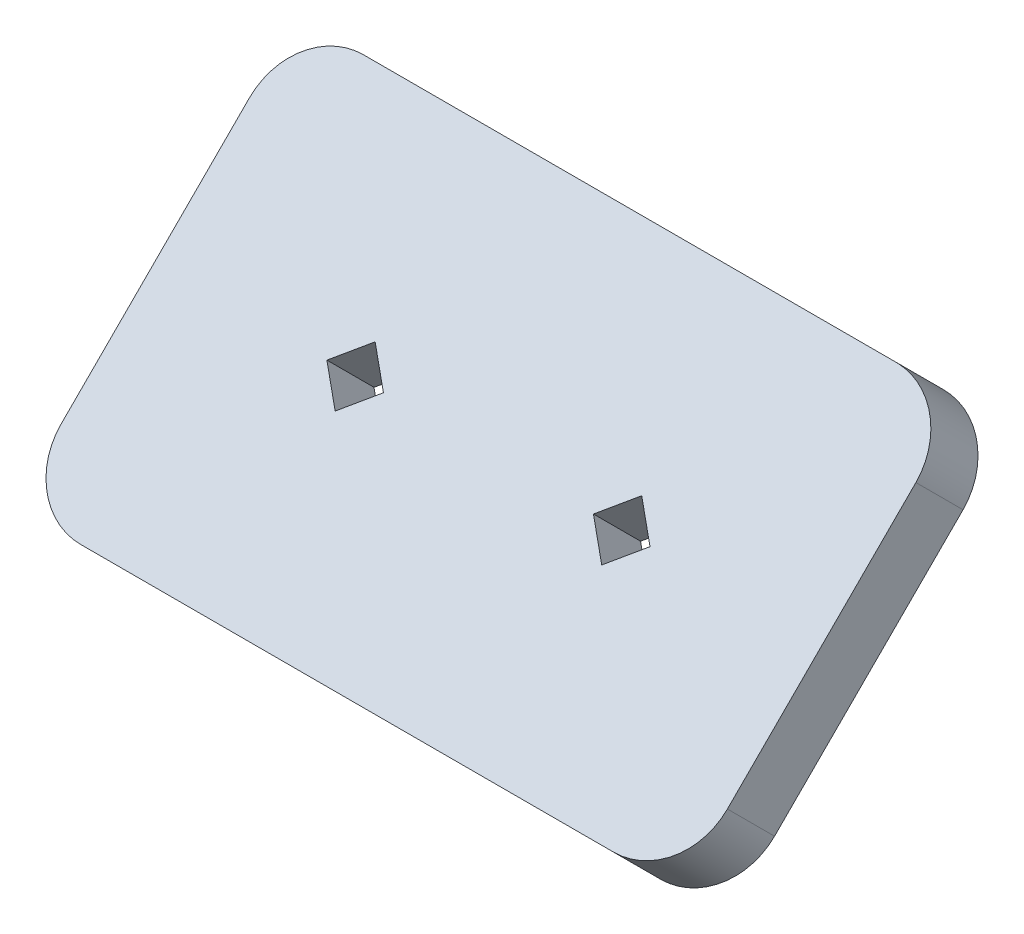
ISO-10303-21;
HEADER;
FILE_DESCRIPTION(('STEP AP214'),'2;1');
FILE_NAME('part.step','',(''),(''),'','','');
FILE_SCHEMA(('AUTOMOTIVE_DESIGN { 1 0 10303 214 1 1 1 1 }'));
ENDSEC;
DATA;
#1=APPLICATION_CONTEXT('core data for automotive mechanical design processes');
#2=APPLICATION_PROTOCOL_DEFINITION('international standard','automotive_design',2000,#1);
#3=PRODUCT_CONTEXT('',#1,'mechanical');
#4=PRODUCT('Part','Part','',(#3));
#5=PRODUCT_RELATED_PRODUCT_CATEGORY('part','',(#4));
#6=PRODUCT_DEFINITION_FORMATION('','',#4);
#7=PRODUCT_DEFINITION_CONTEXT('part definition',#1,'design');
#8=PRODUCT_DEFINITION('design','',#6,#7);
#9=PRODUCT_DEFINITION_SHAPE('','',#8);
#10=(LENGTH_UNIT() NAMED_UNIT(*) SI_UNIT(.MILLI.,.METRE.));
#11=(NAMED_UNIT(*) PLANE_ANGLE_UNIT() SI_UNIT($,.RADIAN.));
#12=(NAMED_UNIT(*) SI_UNIT($,.STERADIAN.) SOLID_ANGLE_UNIT());
#13=UNCERTAINTY_MEASURE_WITH_UNIT(LENGTH_MEASURE(1.E-05),#10,'distance_accuracy_value','');
#14=(GEOMETRIC_REPRESENTATION_CONTEXT(3) GLOBAL_UNCERTAINTY_ASSIGNED_CONTEXT((#13)) GLOBAL_UNIT_ASSIGNED_CONTEXT((#10,
#11,#12)) REPRESENTATION_CONTEXT('',''));
#15=CARTESIAN_POINT('',(0.,0.,0.));
#16=DIRECTION('',(0.,0.,1.));
#17=DIRECTION('',(1.,0.,0.));
#18=AXIS2_PLACEMENT_3D('',#15,#16,#17);
#19=CARTESIAN_POINT('',(17.5,38.138785920236,59.1752126605359));
#20=DIRECTION('',(0.,-0.707106781186547,-0.707106781186548));
#21=DIRECTION('',(0.,0.707106781186548,-0.707106781186547));
#22=AXIS2_PLACEMENT_3D('',#19,#20,#21);
#23=PLANE('',#22);
#24=DIRECTION('',(0.707106781186548,-0.5,0.5));
#25=VECTOR('',#24,1.);
#26=CARTESIAN_POINT('',(25.3786796564404,48.7453876380342,48.5686109427377));
#27=LINE('',#26,#25);
#28=CARTESIAN_POINT('',(25.3786796564404,48.7453876380342,48.5686109427377));
#29=VERTEX_POINT('',#28);
#30=CARTESIAN_POINT('',(27.5,47.2453876380342,50.0686109427377));
#31=VERTEX_POINT('',#30);
#32=EDGE_CURVE('E122',#29,#31,#27,.T.);
#33=ORIENTED_EDGE('',*,*,#32,.T.);
#34=DIRECTION('',(0.707106781186546,0.500000000000001,-0.500000000000001));
#35=VECTOR('',#34,1.);
#36=CARTESIAN_POINT('',(27.5,47.2453876380342,50.0686109427377));
#37=LINE('',#36,#35);
#38=CARTESIAN_POINT('',(29.6213203435596,48.7453876380342,48.5686109427377));
#39=VERTEX_POINT('',#38);
#40=EDGE_CURVE('E116',#31,#39,#37,.T.);
#41=ORIENTED_EDGE('',*,*,#40,.T.);
#42=DIRECTION('',(-0.707106781186548,0.5,-0.5));
#43=VECTOR('',#42,1.);
#44=CARTESIAN_POINT('',(29.6213203435596,48.7453876380342,48.5686109427377));
#45=LINE('',#44,#43);
#46=CARTESIAN_POINT('',(27.5,50.2453876380342,47.0686109427377));
#47=VERTEX_POINT('',#46);
#48=EDGE_CURVE('E119',#39,#47,#45,.T.);
#49=ORIENTED_EDGE('',*,*,#48,.T.);
#50=DIRECTION('',(-0.707106781186548,-0.5,0.5));
#51=VECTOR('',#50,1.);
#52=CARTESIAN_POINT('',(27.5,50.2453876380342,47.0686109427377));
#53=LINE('',#52,#51);
#54=EDGE_CURVE('E84',#47,#29,#53,.T.);
#55=ORIENTED_EDGE('',*,*,#54,.T.);
#56=EDGE_LOOP('',(#33,#41,#49,#55));
#57=FACE_BOUND('',#56,.T.);
#58=DIRECTION('',(0.707106781186547,-0.5,0.5));
#59=VECTOR('',#58,1.);
#60=CARTESIAN_POINT('',(45.3786796564404,48.7453876380342,48.5686109427377));
#61=LINE('',#60,#59);
#62=CARTESIAN_POINT('',(45.3786796564404,48.7453876380342,48.5686109427377));
#63=VERTEX_POINT('',#62);
#64=CARTESIAN_POINT('',(47.5,47.2453876380342,50.0686109427377));
#65=VERTEX_POINT('',#64);
#66=EDGE_CURVE('E113',#63,#65,#61,.T.);
#67=ORIENTED_EDGE('',*,*,#66,.T.);
#68=DIRECTION('',(0.707106781186546,0.500000000000002,-0.500000000000001));
#69=VECTOR('',#68,1.);
#70=CARTESIAN_POINT('',(47.5,47.2453876380342,50.0686109427377));
#71=LINE('',#70,#69);
#72=CARTESIAN_POINT('',(49.6213203435597,48.7453876380342,48.5686109427377));
#73=VERTEX_POINT('',#72);
#74=EDGE_CURVE('E103',#65,#73,#71,.T.);
#75=ORIENTED_EDGE('',*,*,#74,.T.);
#76=DIRECTION('',(-0.707106781186548,0.5,-0.5));
#77=VECTOR('',#76,1.);
#78=CARTESIAN_POINT('',(49.6213203435597,48.7453876380342,48.5686109427377));
#79=LINE('',#78,#77);
#80=CARTESIAN_POINT('',(47.5,50.2453876380342,47.0686109427377));
#81=VERTEX_POINT('',#80);
#82=EDGE_CURVE('E107',#73,#81,#79,.T.);
#83=ORIENTED_EDGE('',*,*,#82,.T.);
#84=DIRECTION('',(-0.707106781186547,-0.500000000000001,0.5));
#85=VECTOR('',#84,1.);
#86=CARTESIAN_POINT('',(47.5,50.2453876380342,47.0686109427377));
#87=LINE('',#86,#85);
#88=EDGE_CURVE('E110',#81,#63,#87,.T.);
#89=ORIENTED_EDGE('',*,*,#88,.T.);
#90=EDGE_LOOP('',(#67,#75,#83,#89));
#91=FACE_BOUND('',#90,.T.);
#92=DIRECTION('',(-1.,0.,0.));
#93=VECTOR('',#92,1.);
#94=CARTESIAN_POINT('',(62.5,38.138785920236,59.1752126605359));
#95=LINE('',#94,#93);
#96=CARTESIAN_POINT('',(57.5,38.138785920236,59.1752126605359));
#97=VERTEX_POINT('',#96);
#98=CARTESIAN_POINT('',(17.5,38.138785920236,59.1752126605359));
#99=VERTEX_POINT('',#98);
#100=EDGE_CURVE('E237',#97,#99,#95,.T.);
#101=ORIENTED_EDGE('',*,*,#100,.T.);
#102=CARTESIAN_POINT('',(17.5,41.6743198261687,55.6396787546031));
#103=DIRECTION('',(0.,-0.707106781186547,-0.707106781186548));
#104=DIRECTION('',(0.,0.707106781186548,-0.707106781186547));
#105=AXIS2_PLACEMENT_3D('',#102,#103,#104);
#106=CIRCLE('',#105,5.);
#107=CARTESIAN_POINT('',(12.5,41.6743198261687,55.6396787546031));
#108=VERTEX_POINT('',#107);
#109=EDGE_CURVE('E367',#99,#108,#106,.T.);
#110=ORIENTED_EDGE('',*,*,#109,.T.);
#111=DIRECTION('',(0.,-0.707106781186548,0.707106781186547));
#112=VECTOR('',#111,1.);
#113=CARTESIAN_POINT('',(12.5,59.3519893558324,37.9620092249395));
#114=LINE('',#113,#112);
#115=CARTESIAN_POINT('',(12.5,55.8164554498997,41.4975431308722));
#116=VERTEX_POINT('',#115);
#117=EDGE_CURVE('E254',#116,#108,#114,.T.);
#118=ORIENTED_EDGE('',*,*,#117,.F.);
#119=CARTESIAN_POINT('',(17.5,55.8164554498997,41.4975431308722));
#120=DIRECTION('',(0.,-0.707106781186547,-0.707106781186548));
#121=DIRECTION('',(0.,0.707106781186548,-0.707106781186547));
#122=AXIS2_PLACEMENT_3D('',#119,#120,#121);
#123=CIRCLE('',#122,5.);
#124=CARTESIAN_POINT('',(17.5,59.3519893558324,37.9620092249395));
#125=VERTEX_POINT('',#124);
#126=EDGE_CURVE('E244',#116,#125,#123,.T.);
#127=ORIENTED_EDGE('',*,*,#126,.T.);
#128=DIRECTION('',(-1.,0.,0.));
#129=VECTOR('',#128,1.);
#130=CARTESIAN_POINT('',(62.5,59.3519893558325,37.9620092249395));
#131=LINE('',#130,#129);
#132=CARTESIAN_POINT('',(57.5,59.3519893558325,37.9620092249395));
#133=VERTEX_POINT('',#132);
#134=EDGE_CURVE('E267',#133,#125,#131,.T.);
#135=ORIENTED_EDGE('',*,*,#134,.F.);
#136=CARTESIAN_POINT('',(57.5,55.8164554498997,41.4975431308722));
#137=DIRECTION('',(0.,-0.707106781186547,-0.707106781186548));
#138=DIRECTION('',(0.,0.707106781186548,-0.707106781186547));
#139=AXIS2_PLACEMENT_3D('',#136,#137,#138);
#140=CIRCLE('',#139,5.);
#141=CARTESIAN_POINT('',(62.5,55.8164554498997,41.4975431308722));
#142=VERTEX_POINT('',#141);
#143=EDGE_CURVE('E243',#133,#142,#140,.T.);
#144=ORIENTED_EDGE('',*,*,#143,.T.);
#145=DIRECTION('',(0.,-0.707106781186548,0.707106781186547));
#146=VECTOR('',#145,1.);
#147=CARTESIAN_POINT('',(62.5,59.3519893558325,37.9620092249395));
#148=LINE('',#147,#146);
#149=CARTESIAN_POINT('',(62.5,41.6743198261688,55.6396787546031));
#150=VERTEX_POINT('',#149);
#151=EDGE_CURVE('E127',#142,#150,#148,.T.);
#152=ORIENTED_EDGE('',*,*,#151,.T.);
#153=CARTESIAN_POINT('',(57.5,41.6743198261688,55.6396787546031));
#154=DIRECTION('',(0.,-0.707106781186547,-0.707106781186548));
#155=DIRECTION('',(0.,0.707106781186548,-0.707106781186547));
#156=AXIS2_PLACEMENT_3D('',#153,#154,#155);
#157=CIRCLE('',#156,5.);
#158=EDGE_CURVE('E235',#150,#97,#157,.T.);
#159=ORIENTED_EDGE('',*,*,#158,.T.);
#160=EDGE_LOOP('',(#101,#110,#118,#127,#135,#144,#152,#159));
#161=FACE_BOUND('',#160,.T.);
#162=ADVANCED_FACE('F36',(#57,#91,#161),#23,.T.);
#163=CARTESIAN_POINT('',(12.5,62.8875232617652,41.4975431308722));
#164=DIRECTION('',(1.,0.,0.));
#165=DIRECTION('',(0.,1.,0.));
#166=AXIS2_PLACEMENT_3D('',#163,#164,#165);
#167=PLANE('',#166);
#168=ORIENTED_EDGE('',*,*,#117,.T.);
#169=DIRECTION('',(0.,-0.707106781186547,-0.707106781186548));
#170=VECTOR('',#169,1.);
#171=CARTESIAN_POINT('',(12.5,45.2098537321015,59.1752126605359));
#172=LINE('',#171,#170);
#173=CARTESIAN_POINT('',(12.5,45.2098537321015,59.1752126605359));
#174=VERTEX_POINT('',#173);
#175=EDGE_CURVE('E362',#108,#174,#172,.F.);
#176=ORIENTED_EDGE('',*,*,#175,.T.);
#177=DIRECTION('',(0.,-0.707106781186548,0.707106781186547));
#178=VECTOR('',#177,1.);
#179=CARTESIAN_POINT('',(12.5,62.8875232617652,41.4975431308722));
#180=LINE('',#179,#178);
#181=CARTESIAN_POINT('',(12.5,59.3519893558324,45.0330770368049));
#182=VERTEX_POINT('',#181);
#183=EDGE_CURVE('E262',#182,#174,#180,.T.);
#184=ORIENTED_EDGE('',*,*,#183,.F.);
#185=DIRECTION('',(0.,-0.707106781186547,-0.707106781186548));
#186=VECTOR('',#185,1.);
#187=CARTESIAN_POINT('',(12.5,59.3519893558324,45.0330770368049));
#188=LINE('',#187,#186);
#189=EDGE_CURVE('E364',#182,#116,#188,.T.);
#190=ORIENTED_EDGE('',*,*,#189,.T.);
#191=EDGE_LOOP('',(#168,#176,#184,#190));
#192=FACE_BOUND('',#191,.T.);
#193=ADVANCED_FACE('F293',(#192),#167,.F.);
#194=CARTESIAN_POINT('',(62.5,41.6743198261687,62.7107465664686));
#195=DIRECTION('',(0.,-0.707106781186548,0.707106781186547));
#196=DIRECTION('',(0.,-0.707106781186547,-0.707106781186548));
#197=AXIS2_PLACEMENT_3D('',#194,#195,#196);
#198=PLANE('',#197);
#199=DIRECTION('',(-1.,0.,0.));
#200=VECTOR('',#199,1.);
#201=CARTESIAN_POINT('',(62.5,41.6743198261687,62.7107465664686));
#202=LINE('',#201,#200);
#203=CARTESIAN_POINT('',(57.5,41.6743198261687,62.7107465664686));
#204=VERTEX_POINT('',#203);
#205=CARTESIAN_POINT('',(17.5,41.6743198261687,62.7107465664686));
#206=VERTEX_POINT('',#205);
#207=EDGE_CURVE('E276',#204,#206,#202,.T.);
#208=ORIENTED_EDGE('',*,*,#207,.T.);
#209=DIRECTION('',(0.,-0.707106781186547,-0.707106781186548));
#210=VECTOR('',#209,1.);
#211=CARTESIAN_POINT('',(17.5,38.138785920236,59.1752126605359));
#212=LINE('',#211,#210);
#213=EDGE_CURVE('E253',#206,#99,#212,.T.);
#214=ORIENTED_EDGE('',*,*,#213,.T.);
#215=ORIENTED_EDGE('',*,*,#100,.F.);
#216=DIRECTION('',(0.,-0.707106781186547,-0.707106781186548));
#217=VECTOR('',#216,1.);
#218=CARTESIAN_POINT('',(57.5,41.6743198261687,62.7107465664686));
#219=LINE('',#218,#217);
#220=EDGE_CURVE('E250',#97,#204,#219,.F.);
#221=ORIENTED_EDGE('',*,*,#220,.T.);
#222=EDGE_LOOP('',(#208,#214,#215,#221));
#223=FACE_BOUND('',#222,.T.);
#224=ADVANCED_FACE('F249',(#223),#198,.T.);
#225=CARTESIAN_POINT('',(62.5,62.8875232617652,41.4975431308722));
#226=DIRECTION('',(0.,-0.707106781186548,0.707106781186547));
#227=DIRECTION('',(0.,-0.707106781186547,-0.707106781186548));
#228=AXIS2_PLACEMENT_3D('',#225,#226,#227);
#229=PLANE('',#228);
#230=ORIENTED_EDGE('',*,*,#134,.T.);
#231=DIRECTION('',(0.,-0.707106781186547,-0.707106781186548));
#232=VECTOR('',#231,1.);
#233=CARTESIAN_POINT('',(17.5,62.8875232617652,41.4975431308722));
#234=LINE('',#233,#232);
#235=CARTESIAN_POINT('',(17.5,62.8875232617652,41.4975431308722));
#236=VERTEX_POINT('',#235);
#237=EDGE_CURVE('E348',#125,#236,#234,.F.);
#238=ORIENTED_EDGE('',*,*,#237,.T.);
#239=DIRECTION('',(-1.,0.,0.));
#240=VECTOR('',#239,1.);
#241=CARTESIAN_POINT('',(62.5,62.8875232617652,41.4975431308722));
#242=LINE('',#241,#240);
#243=CARTESIAN_POINT('',(57.5,62.8875232617652,41.4975431308722));
#244=VERTEX_POINT('',#243);
#245=EDGE_CURVE('E259',#244,#236,#242,.T.);
#246=ORIENTED_EDGE('',*,*,#245,.F.);
#247=DIRECTION('',(0.,-0.707106781186547,-0.707106781186548));
#248=VECTOR('',#247,1.);
#249=CARTESIAN_POINT('',(57.5,59.3519893558325,37.9620092249395));
#250=LINE('',#249,#248);
#251=EDGE_CURVE('E352',#244,#133,#250,.T.);
#252=ORIENTED_EDGE('',*,*,#251,.T.);
#253=EDGE_LOOP('',(#230,#238,#246,#252));
#254=FACE_BOUND('',#253,.T.);
#255=ADVANCED_FACE('F301',(#254),#229,.F.);
#256=CARTESIAN_POINT('',(62.5,62.8875232617652,41.4975431308722));
#257=DIRECTION('',(1.,0.,0.));
#258=DIRECTION('',(0.,0.,-1.));
#259=AXIS2_PLACEMENT_3D('',#256,#257,#258);
#260=PLANE('',#259);
#261=DIRECTION('',(0.,-0.707106781186548,0.707106781186547));
#262=VECTOR('',#261,1.);
#263=CARTESIAN_POINT('',(62.5,62.8875232617652,41.4975431308722));
#264=LINE('',#263,#262);
#265=CARTESIAN_POINT('',(62.5,59.3519893558324,45.0330770368049));
#266=VERTEX_POINT('',#265);
#267=CARTESIAN_POINT('',(62.5,45.2098537321015,59.1752126605359));
#268=VERTEX_POINT('',#267);
#269=EDGE_CURVE('E270',#266,#268,#264,.T.);
#270=ORIENTED_EDGE('',*,*,#269,.T.);
#271=DIRECTION('',(0.,-0.707106781186547,-0.707106781186548));
#272=VECTOR('',#271,1.);
#273=CARTESIAN_POINT('',(62.5,45.2098537321015,59.1752126605359));
#274=LINE('',#273,#272);
#275=EDGE_CURVE('E106',#268,#150,#274,.T.);
#276=ORIENTED_EDGE('',*,*,#275,.T.);
#277=ORIENTED_EDGE('',*,*,#151,.F.);
#278=DIRECTION('',(0.,-0.707106781186547,-0.707106781186548));
#279=VECTOR('',#278,1.);
#280=CARTESIAN_POINT('',(62.5,59.3519893558324,45.0330770368049));
#281=LINE('',#280,#279);
#282=EDGE_CURVE('E346',#142,#266,#281,.F.);
#283=ORIENTED_EDGE('',*,*,#282,.T.);
#284=EDGE_LOOP('',(#270,#276,#277,#283));
#285=FACE_BOUND('',#284,.T.);
#286=ADVANCED_FACE('F290',(#285),#260,.T.);
#287=CARTESIAN_POINT('',(49.6213203435597,43.795640169644,43.6188634743474));
#288=DIRECTION('',(0.707106781186547,0.500000000000001,-0.5));
#289=DIRECTION('',(-0.577350269189627,0.816496580927725,0.));
#290=AXIS2_PLACEMENT_3D('',#287,#288,#289);
#291=PLANE('',#290);
#292=ORIENTED_EDGE('',*,*,#82,.F.);
#293=DIRECTION('',(0.,0.707106781186547,0.707106781186548));
#294=VECTOR('',#293,1.);
#295=CARTESIAN_POINT('',(49.6213203435597,43.795640169644,43.6188634743474));
#296=LINE('',#295,#294);
#297=CARTESIAN_POINT('',(49.6213203435597,52.280921543967,52.1041448486704));
#298=VERTEX_POINT('',#297);
#299=EDGE_CURVE('E130',#73,#298,#296,.T.);
#300=ORIENTED_EDGE('',*,*,#299,.T.);
#301=DIRECTION('',(-0.707106781186548,0.499999999999999,-0.499999999999999));
#302=VECTOR('',#301,1.);
#303=CARTESIAN_POINT('',(49.6213203435597,52.280921543967,52.1041448486704));
#304=LINE('',#303,#302);
#305=CARTESIAN_POINT('',(47.5,53.780921543967,50.6041448486704));
#306=VERTEX_POINT('',#305);
#307=EDGE_CURVE('E153',#298,#306,#304,.T.);
#308=ORIENTED_EDGE('',*,*,#307,.T.);
#309=DIRECTION('',(0.,0.707106781186547,0.707106781186548));
#310=VECTOR('',#309,1.);
#311=CARTESIAN_POINT('',(47.5,45.295640169644,42.1188634743474));
#312=LINE('',#311,#310);
#313=EDGE_CURVE('E132',#81,#306,#312,.T.);
#314=ORIENTED_EDGE('',*,*,#313,.F.);
#315=EDGE_LOOP('',(#292,#300,#308,#314));
#316=FACE_BOUND('',#315,.T.);
#317=ADVANCED_FACE('F281',(#316),#291,.F.);
#318=CARTESIAN_POINT('',(47.5,42.295640169644,45.1188634743474));
#319=DIRECTION('',(0.707106781186549,-0.499999999999999,0.499999999999999));
#320=DIRECTION('',(0.577350269189624,0.,-0.816496580927727));
#321=AXIS2_PLACEMENT_3D('',#318,#319,#320);
#322=PLANE('',#321);
#323=ORIENTED_EDGE('',*,*,#74,.F.);
#324=DIRECTION('',(0.,0.707106781186547,0.707106781186548));
#325=VECTOR('',#324,1.);
#326=CARTESIAN_POINT('',(47.5,42.295640169644,45.1188634743474));
#327=LINE('',#326,#325);
#328=CARTESIAN_POINT('',(47.5,50.780921543967,53.6041448486704));
#329=VERTEX_POINT('',#328);
#330=EDGE_CURVE('E11',#65,#329,#327,.T.);
#331=ORIENTED_EDGE('',*,*,#330,.T.);
#332=DIRECTION('',(0.707106781186546,0.500000000000001,-0.500000000000001));
#333=VECTOR('',#332,1.);
#334=CARTESIAN_POINT('',(47.5,50.780921543967,53.6041448486704));
#335=LINE('',#334,#333);
#336=EDGE_CURVE('E156',#329,#298,#335,.T.);
#337=ORIENTED_EDGE('',*,*,#336,.T.);
#338=ORIENTED_EDGE('',*,*,#299,.F.);
#339=EDGE_LOOP('',(#323,#331,#337,#338));
#340=FACE_BOUND('',#339,.T.);
#341=ADVANCED_FACE('F282',(#340),#322,.F.);
#342=CARTESIAN_POINT('',(29.6213203435596,43.7956401696439,43.6188634743474));
#343=DIRECTION('',(0.707106781186547,0.500000000000001,-0.5));
#344=DIRECTION('',(-0.577350269189626,0.816496580927725,0.));
#345=AXIS2_PLACEMENT_3D('',#342,#343,#344);
#346=PLANE('',#345);
#347=ORIENTED_EDGE('',*,*,#48,.F.);
#348=DIRECTION('',(0.,0.707106781186547,0.707106781186548));
#349=VECTOR('',#348,1.);
#350=CARTESIAN_POINT('',(29.6213203435596,43.7956401696439,43.6188634743474));
#351=LINE('',#350,#349);
#352=CARTESIAN_POINT('',(29.6213203435596,52.280921543967,52.1041448486704));
#353=VERTEX_POINT('',#352);
#354=EDGE_CURVE('E67',#39,#353,#351,.T.);
#355=ORIENTED_EDGE('',*,*,#354,.T.);
#356=DIRECTION('',(-0.707106781186548,0.500000000000001,-0.499999999999999));
#357=VECTOR('',#356,1.);
#358=CARTESIAN_POINT('',(29.6213203435596,52.280921543967,52.1041448486704));
#359=LINE('',#358,#357);
#360=CARTESIAN_POINT('',(27.5,53.780921543967,50.6041448486704));
#361=VERTEX_POINT('',#360);
#362=EDGE_CURVE('E89',#353,#361,#359,.T.);
#363=ORIENTED_EDGE('',*,*,#362,.T.);
#364=DIRECTION('',(0.,0.707106781186547,0.707106781186548));
#365=VECTOR('',#364,1.);
#366=CARTESIAN_POINT('',(27.5,45.295640169644,42.1188634743474));
#367=LINE('',#366,#365);
#368=EDGE_CURVE('E75',#47,#361,#367,.T.);
#369=ORIENTED_EDGE('',*,*,#368,.F.);
#370=EDGE_LOOP('',(#347,#355,#363,#369));
#371=FACE_BOUND('',#370,.T.);
#372=ADVANCED_FACE('F90',(#371),#346,.F.);
#373=CARTESIAN_POINT('',(27.5,42.295640169644,45.1188634743474));
#374=DIRECTION('',(0.707106781186549,-0.499999999999999,0.499999999999999));
#375=DIRECTION('',(0.577350269189624,0.,-0.816496580927727));
#376=AXIS2_PLACEMENT_3D('',#373,#374,#375);
#377=PLANE('',#376);
#378=ORIENTED_EDGE('',*,*,#40,.F.);
#379=DIRECTION('',(0.,0.707106781186547,0.707106781186548));
#380=VECTOR('',#379,1.);
#381=CARTESIAN_POINT('',(27.5,42.295640169644,45.1188634743474));
#382=LINE('',#381,#380);
#383=CARTESIAN_POINT('',(27.5,50.780921543967,53.6041448486704));
#384=VERTEX_POINT('',#383);
#385=EDGE_CURVE('E125',#31,#384,#382,.T.);
#386=ORIENTED_EDGE('',*,*,#385,.T.);
#387=DIRECTION('',(0.707106781186546,0.5,-0.500000000000002));
#388=VECTOR('',#387,1.);
#389=CARTESIAN_POINT('',(27.5,50.780921543967,53.6041448486704));
#390=LINE('',#389,#388);
#391=EDGE_CURVE('E93',#384,#353,#390,.T.);
#392=ORIENTED_EDGE('',*,*,#391,.T.);
#393=ORIENTED_EDGE('',*,*,#354,.F.);
#394=EDGE_LOOP('',(#378,#386,#392,#393));
#395=FACE_BOUND('',#394,.T.);
#396=ADVANCED_FACE('F163',(#395),#377,.F.);
#397=CARTESIAN_POINT('',(0.,52.1925331963187,52.1925331963187));
#398=DIRECTION('',(0.,-0.707106781186547,-0.707106781186548));
#399=DIRECTION('',(0.,0.707106781186548,-0.707106781186547));
#400=AXIS2_PLACEMENT_3D('',#397,#398,#399);
#401=PLANE('',#400);
#402=ORIENTED_EDGE('',*,*,#362,.F.);
#403=ORIENTED_EDGE('',*,*,#391,.F.);
#404=DIRECTION('',(0.707106781186547,-0.5,0.5));
#405=VECTOR('',#404,1.);
#406=CARTESIAN_POINT('',(25.3786796564404,52.280921543967,52.1041448486704));
#407=LINE('',#406,#405);
#408=CARTESIAN_POINT('',(25.3786796564404,52.2809215439669,52.1041448486704));
#409=VERTEX_POINT('',#408);
#410=EDGE_CURVE('E98',#409,#384,#407,.T.);
#411=ORIENTED_EDGE('',*,*,#410,.F.);
#412=DIRECTION('',(-0.707106781186547,-0.5,0.5));
#413=VECTOR('',#412,1.);
#414=CARTESIAN_POINT('',(27.5,53.780921543967,50.6041448486704));
#415=LINE('',#414,#413);
#416=EDGE_CURVE('E80',#361,#409,#415,.T.);
#417=ORIENTED_EDGE('',*,*,#416,.F.);
#418=EDGE_LOOP('',(#402,#403,#411,#417));
#419=FACE_BOUND('',#418,.T.);
#420=ORIENTED_EDGE('',*,*,#307,.F.);
#421=ORIENTED_EDGE('',*,*,#336,.F.);
#422=DIRECTION('',(0.707106781186547,-0.499999999999999,0.500000000000001));
#423=VECTOR('',#422,1.);
#424=CARTESIAN_POINT('',(45.3786796564404,52.280921543967,52.1041448486704));
#425=LINE('',#424,#423);
#426=CARTESIAN_POINT('',(45.3786796564404,52.280921543967,52.1041448486704));
#427=VERTEX_POINT('',#426);
#428=EDGE_CURVE('E141',#427,#329,#425,.T.);
#429=ORIENTED_EDGE('',*,*,#428,.F.);
#430=DIRECTION('',(-0.707106781186547,-0.500000000000002,0.499999999999999));
#431=VECTOR('',#430,1.);
#432=CARTESIAN_POINT('',(47.5,53.780921543967,50.6041448486704));
#433=LINE('',#432,#431);
#434=EDGE_CURVE('E133',#306,#427,#433,.T.);
#435=ORIENTED_EDGE('',*,*,#434,.F.);
#436=EDGE_LOOP('',(#420,#421,#429,#435));
#437=FACE_BOUND('',#436,.T.);
#438=ORIENTED_EDGE('',*,*,#183,.T.);
#439=CARTESIAN_POINT('',(17.5,45.2098537321015,59.1752126605359));
#440=DIRECTION('',(0.,-0.707106781186547,-0.707106781186548));
#441=DIRECTION('',(0.,0.707106781186548,-0.707106781186547));
#442=AXIS2_PLACEMENT_3D('',#439,#440,#441);
#443=CIRCLE('',#442,5.);
#444=EDGE_CURVE('E355',#174,#206,#443,.F.);
#445=ORIENTED_EDGE('',*,*,#444,.T.);
#446=ORIENTED_EDGE('',*,*,#207,.F.);
#447=CARTESIAN_POINT('',(57.5,45.2098537321015,59.1752126605359));
#448=DIRECTION('',(0.,-0.707106781186547,-0.707106781186548));
#449=DIRECTION('',(0.,0.707106781186548,-0.707106781186547));
#450=AXIS2_PLACEMENT_3D('',#447,#448,#449);
#451=CIRCLE('',#450,5.);
#452=EDGE_CURVE('E258',#204,#268,#451,.F.);
#453=ORIENTED_EDGE('',*,*,#452,.T.);
#454=ORIENTED_EDGE('',*,*,#269,.F.);
#455=CARTESIAN_POINT('',(57.5,59.3519893558325,45.0330770368049));
#456=DIRECTION('',(0.,-0.707106781186547,-0.707106781186548));
#457=DIRECTION('',(0.,0.707106781186548,-0.707106781186547));
#458=AXIS2_PLACEMENT_3D('',#455,#456,#457);
#459=CIRCLE('',#458,5.);
#460=EDGE_CURVE('E360',#266,#244,#459,.F.);
#461=ORIENTED_EDGE('',*,*,#460,.T.);
#462=ORIENTED_EDGE('',*,*,#245,.T.);
#463=CARTESIAN_POINT('',(17.5,59.3519893558324,45.0330770368049));
#464=DIRECTION('',(0.,-0.707106781186547,-0.707106781186548));
#465=DIRECTION('',(0.,0.707106781186548,-0.707106781186547));
#466=AXIS2_PLACEMENT_3D('',#463,#464,#465);
#467=CIRCLE('',#466,5.);
#468=EDGE_CURVE('E357',#236,#182,#467,.F.);
#469=ORIENTED_EDGE('',*,*,#468,.T.);
#470=EDGE_LOOP('',(#438,#445,#446,#453,#454,#461,#462,#469));
#471=FACE_BOUND('',#470,.T.);
#472=ADVANCED_FACE('F95',(#419,#437,#471),#401,.F.);
#473=CARTESIAN_POINT('',(27.5,45.295640169644,42.1188634743474));
#474=DIRECTION('',(-0.707106781186547,0.5,-0.5));
#475=DIRECTION('',(-0.577350269189626,0.,0.816496580927726));
#476=AXIS2_PLACEMENT_3D('',#473,#474,#475);
#477=PLANE('',#476);
#478=ORIENTED_EDGE('',*,*,#54,.F.);
#479=ORIENTED_EDGE('',*,*,#368,.T.);
#480=ORIENTED_EDGE('',*,*,#416,.T.);
#481=DIRECTION('',(0.,0.707106781186547,0.707106781186548));
#482=VECTOR('',#481,1.);
#483=CARTESIAN_POINT('',(25.3786796564404,43.7956401696439,43.6188634743474));
#484=LINE('',#483,#482);
#485=EDGE_CURVE('E86',#29,#409,#484,.T.);
#486=ORIENTED_EDGE('',*,*,#485,.F.);
#487=EDGE_LOOP('',(#478,#479,#480,#486));
#488=FACE_BOUND('',#487,.T.);
#489=ADVANCED_FACE('F76',(#488),#477,.F.);
#490=CARTESIAN_POINT('',(25.3786796564404,43.7956401696439,43.6188634743474));
#491=DIRECTION('',(-0.707106781186547,-0.5,0.5));
#492=DIRECTION('',(0.577350269189626,-0.816496580927726,0.));
#493=AXIS2_PLACEMENT_3D('',#490,#491,#492);
#494=PLANE('',#493);
#495=ORIENTED_EDGE('',*,*,#32,.F.);
#496=ORIENTED_EDGE('',*,*,#485,.T.);
#497=ORIENTED_EDGE('',*,*,#410,.T.);
#498=ORIENTED_EDGE('',*,*,#385,.F.);
#499=EDGE_LOOP('',(#495,#496,#497,#498));
#500=FACE_BOUND('',#499,.T.);
#501=ADVANCED_FACE('F169',(#500),#494,.F.);
#502=CARTESIAN_POINT('',(47.5,45.295640169644,42.1188634743474));
#503=DIRECTION('',(-0.707106781186548,0.5,-0.5));
#504=DIRECTION('',(-0.577350269189625,0.,0.816496580927726));
#505=AXIS2_PLACEMENT_3D('',#502,#503,#504);
#506=PLANE('',#505);
#507=ORIENTED_EDGE('',*,*,#88,.F.);
#508=ORIENTED_EDGE('',*,*,#313,.T.);
#509=ORIENTED_EDGE('',*,*,#434,.T.);
#510=DIRECTION('',(0.,0.707106781186547,0.707106781186548));
#511=VECTOR('',#510,1.);
#512=CARTESIAN_POINT('',(45.3786796564404,43.795640169644,43.6188634743474));
#513=LINE('',#512,#511);
#514=EDGE_CURVE('E45',#63,#427,#513,.T.);
#515=ORIENTED_EDGE('',*,*,#514,.F.);
#516=EDGE_LOOP('',(#507,#508,#509,#515));
#517=FACE_BOUND('',#516,.T.);
#518=ADVANCED_FACE('F149',(#517),#506,.F.);
#519=CARTESIAN_POINT('',(45.3786796564404,43.795640169644,43.6188634743474));
#520=DIRECTION('',(-0.707106781186548,-0.5,0.5));
#521=DIRECTION('',(0.577350269189626,-0.816496580927726,0.));
#522=AXIS2_PLACEMENT_3D('',#519,#520,#521);
#523=PLANE('',#522);
#524=ORIENTED_EDGE('',*,*,#66,.F.);
#525=ORIENTED_EDGE('',*,*,#514,.T.);
#526=ORIENTED_EDGE('',*,*,#428,.T.);
#527=ORIENTED_EDGE('',*,*,#330,.F.);
#528=EDGE_LOOP('',(#524,#525,#526,#527));
#529=FACE_BOUND('',#528,.T.);
#530=ADVANCED_FACE('F38',(#529),#523,.F.);
#531=CARTESIAN_POINT('',(57.5,59.3519893558324,45.0330770368049));
#532=DIRECTION('',(0.,0.707106781186547,0.707106781186548));
#533=DIRECTION('',(0.,-0.707106781186548,0.707106781186547));
#534=AXIS2_PLACEMENT_3D('',#531,#532,#533);
#535=CYLINDRICAL_SURFACE('',#534,5.);
#536=ORIENTED_EDGE('',*,*,#460,.F.);
#537=ORIENTED_EDGE('',*,*,#282,.F.);
#538=ORIENTED_EDGE('',*,*,#143,.F.);
#539=ORIENTED_EDGE('',*,*,#251,.F.);
#540=EDGE_LOOP('',(#536,#537,#538,#539));
#541=FACE_BOUND('',#540,.T.);
#542=ADVANCED_FACE('F322',(#541),#535,.T.);
#543=CARTESIAN_POINT('',(57.5,45.2098537321015,59.1752126605359));
#544=DIRECTION('',(0.,-0.707106781186547,-0.707106781186548));
#545=DIRECTION('',(0.,0.707106781186548,-0.707106781186547));
#546=AXIS2_PLACEMENT_3D('',#543,#544,#545);
#547=CYLINDRICAL_SURFACE('',#546,5.);
#548=ORIENTED_EDGE('',*,*,#452,.F.);
#549=ORIENTED_EDGE('',*,*,#220,.F.);
#550=ORIENTED_EDGE('',*,*,#158,.F.);
#551=ORIENTED_EDGE('',*,*,#275,.F.);
#552=EDGE_LOOP('',(#548,#549,#550,#551));
#553=FACE_BOUND('',#552,.T.);
#554=ADVANCED_FACE('F257',(#553),#547,.T.);
#555=CARTESIAN_POINT('',(17.5,59.3519893558324,45.0330770368049));
#556=DIRECTION('',(0.,-0.707106781186547,-0.707106781186548));
#557=DIRECTION('',(0.,0.707106781186548,-0.707106781186547));
#558=AXIS2_PLACEMENT_3D('',#555,#556,#557);
#559=CYLINDRICAL_SURFACE('',#558,5.);
#560=ORIENTED_EDGE('',*,*,#468,.F.);
#561=ORIENTED_EDGE('',*,*,#237,.F.);
#562=ORIENTED_EDGE('',*,*,#126,.F.);
#563=ORIENTED_EDGE('',*,*,#189,.F.);
#564=EDGE_LOOP('',(#560,#561,#562,#563));
#565=FACE_BOUND('',#564,.T.);
#566=ADVANCED_FACE('F331',(#565),#559,.T.);
#567=CARTESIAN_POINT('',(17.5,45.2098537321015,59.1752126605359));
#568=DIRECTION('',(0.,0.707106781186547,0.707106781186548));
#569=DIRECTION('',(0.,-0.707106781186548,0.707106781186547));
#570=AXIS2_PLACEMENT_3D('',#567,#568,#569);
#571=CYLINDRICAL_SURFACE('',#570,5.);
#572=ORIENTED_EDGE('',*,*,#444,.F.);
#573=ORIENTED_EDGE('',*,*,#175,.F.);
#574=ORIENTED_EDGE('',*,*,#109,.F.);
#575=ORIENTED_EDGE('',*,*,#213,.F.);
#576=EDGE_LOOP('',(#572,#573,#574,#575));
#577=FACE_BOUND('',#576,.T.);
#578=ADVANCED_FACE('F304',(#577),#571,.T.);
#579=CLOSED_SHELL('',(#162,#193,#224,#255,#286,#317,#341,#372,#396,#472,#489,#501,#518,#530,
#542,#554,#566,#578));
#580=MANIFOLD_SOLID_BREP('B2',#579);
#581=ADVANCED_BREP_SHAPE_REPRESENTATION('',(#18,#580),#14);
#582=SHAPE_DEFINITION_REPRESENTATION(#9,#581);
ENDSEC;
END-ISO-10303-21;
